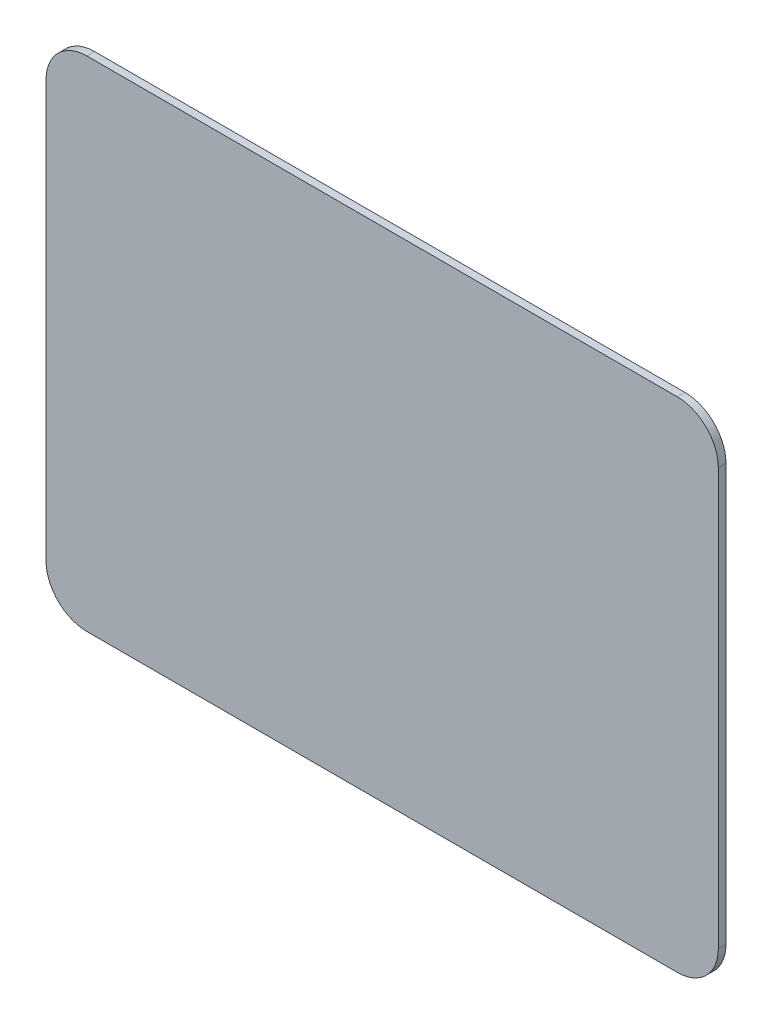
ISO-10303-21;
HEADER;
FILE_DESCRIPTION(('STEP AP214'),'2;1');
FILE_NAME('part.step','',(''),(''),'','','');
FILE_SCHEMA(('AUTOMOTIVE_DESIGN { 1 0 10303 214 1 1 1 1 }'));
ENDSEC;
DATA;
#1=APPLICATION_CONTEXT('core data for automotive mechanical design processes');
#2=APPLICATION_PROTOCOL_DEFINITION('international standard','automotive_design',2000,#1);
#3=PRODUCT_CONTEXT('',#1,'mechanical');
#4=PRODUCT('Part','Part','',(#3));
#5=PRODUCT_RELATED_PRODUCT_CATEGORY('part','',(#4));
#6=PRODUCT_DEFINITION_FORMATION('','',#4);
#7=PRODUCT_DEFINITION_CONTEXT('part definition',#1,'design');
#8=PRODUCT_DEFINITION('design','',#6,#7);
#9=PRODUCT_DEFINITION_SHAPE('','',#8);
#10=(LENGTH_UNIT() NAMED_UNIT(*) SI_UNIT(.MILLI.,.METRE.));
#11=(NAMED_UNIT(*) PLANE_ANGLE_UNIT() SI_UNIT($,.RADIAN.));
#12=(NAMED_UNIT(*) SI_UNIT($,.STERADIAN.) SOLID_ANGLE_UNIT());
#13=UNCERTAINTY_MEASURE_WITH_UNIT(LENGTH_MEASURE(1.E-05),#10,'distance_accuracy_value','');
#14=(GEOMETRIC_REPRESENTATION_CONTEXT(3) GLOBAL_UNCERTAINTY_ASSIGNED_CONTEXT((#13)) GLOBAL_UNIT_ASSIGNED_CONTEXT((#10,
#11,#12)) REPRESENTATION_CONTEXT('',''));
#15=CARTESIAN_POINT('',(0.,0.,0.));
#16=DIRECTION('',(0.,0.,1.));
#17=DIRECTION('',(1.,0.,0.));
#18=AXIS2_PLACEMENT_3D('',#15,#16,#17);
#19=CARTESIAN_POINT('',(0.,0.,0.03));
#20=DIRECTION('',(0.,0.,1.));
#21=DIRECTION('',(1.,0.,0.));
#22=AXIS2_PLACEMENT_3D('',#19,#20,#21);
#23=PLANE('',#22);
#24=CARTESIAN_POINT('',(-1.155,0.815,0.03));
#25=DIRECTION('',(0.,0.,1.));
#26=DIRECTION('',(1.,0.,0.));
#27=AXIS2_PLACEMENT_3D('',#24,#25,#26);
#28=CIRCLE('',#27,0.16);
#29=CARTESIAN_POINT('',(-1.155,0.975,0.03));
#30=VERTEX_POINT('',#29);
#31=CARTESIAN_POINT('',(-1.315,0.815,0.03));
#32=VERTEX_POINT('',#31);
#33=EDGE_CURVE('E123',#30,#32,#28,.T.);
#34=ORIENTED_EDGE('',*,*,#33,.T.);
#35=DIRECTION('',(0.,1.,0.));
#36=VECTOR('',#35,1.);
#37=CARTESIAN_POINT('',(-1.315,-0.815,0.03));
#38=LINE('',#37,#36);
#39=CARTESIAN_POINT('',(-1.315,-0.815,0.03));
#40=VERTEX_POINT('',#39);
#41=EDGE_CURVE('E164',#40,#32,#38,.T.);
#42=ORIENTED_EDGE('',*,*,#41,.F.);
#43=CARTESIAN_POINT('',(-1.155,-0.815,0.03));
#44=DIRECTION('',(0.,0.,1.));
#45=DIRECTION('',(1.,0.,0.));
#46=AXIS2_PLACEMENT_3D('',#43,#44,#45);
#47=CIRCLE('',#46,0.16);
#48=CARTESIAN_POINT('',(-1.155,-0.975,0.03));
#49=VERTEX_POINT('',#48);
#50=EDGE_CURVE('E172',#40,#49,#47,.T.);
#51=ORIENTED_EDGE('',*,*,#50,.T.);
#52=DIRECTION('',(-1.,0.,0.));
#53=VECTOR('',#52,1.);
#54=CARTESIAN_POINT('',(1.155,-0.975,0.03));
#55=LINE('',#54,#53);
#56=CARTESIAN_POINT('',(1.155,-0.975,0.03));
#57=VERTEX_POINT('',#56);
#58=EDGE_CURVE('E100',#57,#49,#55,.T.);
#59=ORIENTED_EDGE('',*,*,#58,.F.);
#60=CARTESIAN_POINT('',(1.155,-0.815,0.03));
#61=DIRECTION('',(0.,0.,1.));
#62=DIRECTION('',(1.,0.,0.));
#63=AXIS2_PLACEMENT_3D('',#60,#61,#62);
#64=CIRCLE('',#63,0.16);
#65=CARTESIAN_POINT('',(1.315,-0.815,0.03));
#66=VERTEX_POINT('',#65);
#67=EDGE_CURVE('E176',#57,#66,#64,.T.);
#68=ORIENTED_EDGE('',*,*,#67,.T.);
#69=DIRECTION('',(0.,-1.,0.));
#70=VECTOR('',#69,1.);
#71=CARTESIAN_POINT('',(1.315,0.815,0.03));
#72=LINE('',#71,#70);
#73=CARTESIAN_POINT('',(1.315,0.815,0.03));
#74=VERTEX_POINT('',#73);
#75=EDGE_CURVE('E60',#74,#66,#72,.T.);
#76=ORIENTED_EDGE('',*,*,#75,.F.);
#77=CARTESIAN_POINT('',(1.155,0.815,0.03));
#78=DIRECTION('',(0.,0.,1.));
#79=DIRECTION('',(1.,0.,0.));
#80=AXIS2_PLACEMENT_3D('',#77,#78,#79);
#81=CIRCLE('',#80,0.16);
#82=CARTESIAN_POINT('',(1.155,0.975,0.03));
#83=VERTEX_POINT('',#82);
#84=EDGE_CURVE('E125',#74,#83,#81,.T.);
#85=ORIENTED_EDGE('',*,*,#84,.T.);
#86=DIRECTION('',(1.,0.,0.));
#87=VECTOR('',#86,1.);
#88=CARTESIAN_POINT('',(-1.155,0.975,0.03));
#89=LINE('',#88,#87);
#90=EDGE_CURVE('E27',#30,#83,#89,.T.);
#91=ORIENTED_EDGE('',*,*,#90,.F.);
#92=EDGE_LOOP('',(#34,#42,#51,#59,#68,#76,#85,#91));
#93=FACE_BOUND('',#92,.T.);
#94=ADVANCED_FACE('F17',(#93),#23,.T.);
#95=CARTESIAN_POINT('',(0.,0.,0.));
#96=DIRECTION('',(0.,0.,1.));
#97=DIRECTION('',(1.,0.,0.));
#98=AXIS2_PLACEMENT_3D('',#95,#96,#97);
#99=PLANE('',#98);
#100=CARTESIAN_POINT('',(-1.155,0.815,0.));
#101=DIRECTION('',(0.,0.,1.));
#102=DIRECTION('',(1.,0.,0.));
#103=AXIS2_PLACEMENT_3D('',#100,#101,#102);
#104=CIRCLE('',#103,0.16);
#105=CARTESIAN_POINT('',(-1.155,0.975,0.));
#106=VERTEX_POINT('',#105);
#107=CARTESIAN_POINT('',(-1.315,0.815,0.));
#108=VERTEX_POINT('',#107);
#109=EDGE_CURVE('E141',#106,#108,#104,.T.);
#110=ORIENTED_EDGE('',*,*,#109,.F.);
#111=DIRECTION('',(1.,0.,0.));
#112=VECTOR('',#111,1.);
#113=CARTESIAN_POINT('',(-1.155,0.975,0.));
#114=LINE('',#113,#112);
#115=CARTESIAN_POINT('',(1.155,0.975,0.));
#116=VERTEX_POINT('',#115);
#117=EDGE_CURVE('E11',#106,#116,#114,.T.);
#118=ORIENTED_EDGE('',*,*,#117,.T.);
#119=CARTESIAN_POINT('',(1.155,0.815,0.));
#120=DIRECTION('',(0.,0.,1.));
#121=DIRECTION('',(1.,0.,0.));
#122=AXIS2_PLACEMENT_3D('',#119,#120,#121);
#123=CIRCLE('',#122,0.16);
#124=CARTESIAN_POINT('',(1.315,0.815,0.));
#125=VERTEX_POINT('',#124);
#126=EDGE_CURVE('E70',#125,#116,#123,.T.);
#127=ORIENTED_EDGE('',*,*,#126,.F.);
#128=DIRECTION('',(0.,-1.,0.));
#129=VECTOR('',#128,1.);
#130=CARTESIAN_POINT('',(1.315,0.815,0.));
#131=LINE('',#130,#129);
#132=CARTESIAN_POINT('',(1.315,-0.815,0.));
#133=VERTEX_POINT('',#132);
#134=EDGE_CURVE('E194',#125,#133,#131,.T.);
#135=ORIENTED_EDGE('',*,*,#134,.T.);
#136=CARTESIAN_POINT('',(1.155,-0.815,0.));
#137=DIRECTION('',(0.,0.,1.));
#138=DIRECTION('',(1.,0.,0.));
#139=AXIS2_PLACEMENT_3D('',#136,#137,#138);
#140=CIRCLE('',#139,0.16);
#141=CARTESIAN_POINT('',(1.155,-0.975,0.));
#142=VERTEX_POINT('',#141);
#143=EDGE_CURVE('E108',#142,#133,#140,.T.);
#144=ORIENTED_EDGE('',*,*,#143,.F.);
#145=DIRECTION('',(-1.,0.,0.));
#146=VECTOR('',#145,1.);
#147=CARTESIAN_POINT('',(1.155,-0.975,0.));
#148=LINE('',#147,#146);
#149=CARTESIAN_POINT('',(-1.155,-0.975,0.));
#150=VERTEX_POINT('',#149);
#151=EDGE_CURVE('E93',#142,#150,#148,.T.);
#152=ORIENTED_EDGE('',*,*,#151,.T.);
#153=CARTESIAN_POINT('',(-1.155,-0.815,0.));
#154=DIRECTION('',(0.,0.,1.));
#155=DIRECTION('',(1.,0.,0.));
#156=AXIS2_PLACEMENT_3D('',#153,#154,#155);
#157=CIRCLE('',#156,0.16);
#158=CARTESIAN_POINT('',(-1.315,-0.815,0.));
#159=VERTEX_POINT('',#158);
#160=EDGE_CURVE('E155',#159,#150,#157,.T.);
#161=ORIENTED_EDGE('',*,*,#160,.F.);
#162=DIRECTION('',(0.,1.,0.));
#163=VECTOR('',#162,1.);
#164=CARTESIAN_POINT('',(-1.315,-0.815,0.));
#165=LINE('',#164,#163);
#166=EDGE_CURVE('E159',#159,#108,#165,.T.);
#167=ORIENTED_EDGE('',*,*,#166,.T.);
#168=EDGE_LOOP('',(#110,#118,#127,#135,#144,#152,#161,#167));
#169=FACE_BOUND('',#168,.T.);
#170=ADVANCED_FACE('F19',(#169),#99,.F.);
#171=CARTESIAN_POINT('',(-1.155,0.975,0.));
#172=DIRECTION('',(0.,1.,0.));
#173=DIRECTION('',(1.,0.,0.));
#174=AXIS2_PLACEMENT_3D('',#171,#172,#173);
#175=PLANE('',#174);
#176=DIRECTION('',(0.,0.,1.));
#177=VECTOR('',#176,1.);
#178=CARTESIAN_POINT('',(-1.155,0.975,0.));
#179=LINE('',#178,#177);
#180=EDGE_CURVE('E132',#106,#30,#179,.T.);
#181=ORIENTED_EDGE('',*,*,#180,.T.);
#182=ORIENTED_EDGE('',*,*,#90,.T.);
#183=DIRECTION('',(0.,0.,1.));
#184=VECTOR('',#183,1.);
#185=CARTESIAN_POINT('',(1.155,0.975,0.));
#186=LINE('',#185,#184);
#187=EDGE_CURVE('E189',#116,#83,#186,.T.);
#188=ORIENTED_EDGE('',*,*,#187,.F.);
#189=ORIENTED_EDGE('',*,*,#117,.F.);
#190=EDGE_LOOP('',(#181,#182,#188,#189));
#191=FACE_BOUND('',#190,.T.);
#192=ADVANCED_FACE('F138',(#191),#175,.T.);
#193=CARTESIAN_POINT('',(1.155,0.815,0.));
#194=DIRECTION('',(0.,0.,-1.));
#195=DIRECTION('',(1.,0.,0.));
#196=AXIS2_PLACEMENT_3D('',#193,#194,#195);
#197=CYLINDRICAL_SURFACE('',#196,0.16);
#198=DIRECTION('',(0.,0.,1.));
#199=VECTOR('',#198,1.);
#200=CARTESIAN_POINT('',(1.315,0.815,0.));
#201=LINE('',#200,#199);
#202=EDGE_CURVE('E186',#125,#74,#201,.T.);
#203=ORIENTED_EDGE('',*,*,#202,.F.);
#204=ORIENTED_EDGE('',*,*,#126,.T.);
#205=ORIENTED_EDGE('',*,*,#187,.T.);
#206=ORIENTED_EDGE('',*,*,#84,.F.);
#207=EDGE_LOOP('',(#203,#204,#205,#206));
#208=FACE_BOUND('',#207,.T.);
#209=ADVANCED_FACE('F203',(#208),#197,.T.);
#210=CARTESIAN_POINT('',(1.315,0.815,0.));
#211=DIRECTION('',(1.,0.,0.));
#212=DIRECTION('',(0.,1.,0.));
#213=AXIS2_PLACEMENT_3D('',#210,#211,#212);
#214=PLANE('',#213);
#215=ORIENTED_EDGE('',*,*,#202,.T.);
#216=ORIENTED_EDGE('',*,*,#75,.T.);
#217=DIRECTION('',(0.,0.,1.));
#218=VECTOR('',#217,1.);
#219=CARTESIAN_POINT('',(1.315,-0.815,0.));
#220=LINE('',#219,#218);
#221=EDGE_CURVE('E151',#133,#66,#220,.T.);
#222=ORIENTED_EDGE('',*,*,#221,.F.);
#223=ORIENTED_EDGE('',*,*,#134,.F.);
#224=EDGE_LOOP('',(#215,#216,#222,#223));
#225=FACE_BOUND('',#224,.T.);
#226=ADVANCED_FACE('F204',(#225),#214,.T.);
#227=CARTESIAN_POINT('',(1.155,-0.815,0.));
#228=DIRECTION('',(0.,0.,-1.));
#229=DIRECTION('',(1.,0.,0.));
#230=AXIS2_PLACEMENT_3D('',#227,#228,#229);
#231=CYLINDRICAL_SURFACE('',#230,0.16);
#232=DIRECTION('',(0.,0.,1.));
#233=VECTOR('',#232,1.);
#234=CARTESIAN_POINT('',(1.155,-0.975,0.));
#235=LINE('',#234,#233);
#236=EDGE_CURVE('E154',#142,#57,#235,.T.);
#237=ORIENTED_EDGE('',*,*,#236,.F.);
#238=ORIENTED_EDGE('',*,*,#143,.T.);
#239=ORIENTED_EDGE('',*,*,#221,.T.);
#240=ORIENTED_EDGE('',*,*,#67,.F.);
#241=EDGE_LOOP('',(#237,#238,#239,#240));
#242=FACE_BOUND('',#241,.T.);
#243=ADVANCED_FACE('F219',(#242),#231,.T.);
#244=CARTESIAN_POINT('',(1.155,-0.975,0.));
#245=DIRECTION('',(0.,-1.,0.));
#246=DIRECTION('',(0.,0.,-1.));
#247=AXIS2_PLACEMENT_3D('',#244,#245,#246);
#248=PLANE('',#247);
#249=ORIENTED_EDGE('',*,*,#236,.T.);
#250=ORIENTED_EDGE('',*,*,#58,.T.);
#251=DIRECTION('',(0.,0.,1.));
#252=VECTOR('',#251,1.);
#253=CARTESIAN_POINT('',(-1.155,-0.975,0.));
#254=LINE('',#253,#252);
#255=EDGE_CURVE('E158',#150,#49,#254,.T.);
#256=ORIENTED_EDGE('',*,*,#255,.F.);
#257=ORIENTED_EDGE('',*,*,#151,.F.);
#258=EDGE_LOOP('',(#249,#250,#256,#257));
#259=FACE_BOUND('',#258,.T.);
#260=ADVANCED_FACE('F222',(#259),#248,.T.);
#261=CARTESIAN_POINT('',(-1.155,-0.815,0.));
#262=DIRECTION('',(0.,0.,-1.));
#263=DIRECTION('',(1.,0.,0.));
#264=AXIS2_PLACEMENT_3D('',#261,#262,#263);
#265=CYLINDRICAL_SURFACE('',#264,0.16);
#266=DIRECTION('',(0.,0.,1.));
#267=VECTOR('',#266,1.);
#268=CARTESIAN_POINT('',(-1.315,-0.815,0.));
#269=LINE('',#268,#267);
#270=EDGE_CURVE('E136',#159,#40,#269,.T.);
#271=ORIENTED_EDGE('',*,*,#270,.F.);
#272=ORIENTED_EDGE('',*,*,#160,.T.);
#273=ORIENTED_EDGE('',*,*,#255,.T.);
#274=ORIENTED_EDGE('',*,*,#50,.F.);
#275=EDGE_LOOP('',(#271,#272,#273,#274));
#276=FACE_BOUND('',#275,.T.);
#277=ADVANCED_FACE('F226',(#276),#265,.T.);
#278=CARTESIAN_POINT('',(-1.315,-0.815,0.));
#279=DIRECTION('',(-1.,0.,0.));
#280=DIRECTION('',(0.,0.,1.));
#281=AXIS2_PLACEMENT_3D('',#278,#279,#280);
#282=PLANE('',#281);
#283=ORIENTED_EDGE('',*,*,#270,.T.);
#284=ORIENTED_EDGE('',*,*,#41,.T.);
#285=DIRECTION('',(0.,0.,1.));
#286=VECTOR('',#285,1.);
#287=CARTESIAN_POINT('',(-1.315,0.815,0.));
#288=LINE('',#287,#286);
#289=EDGE_CURVE('E134',#108,#32,#288,.T.);
#290=ORIENTED_EDGE('',*,*,#289,.F.);
#291=ORIENTED_EDGE('',*,*,#166,.F.);
#292=EDGE_LOOP('',(#283,#284,#290,#291));
#293=FACE_BOUND('',#292,.T.);
#294=ADVANCED_FACE('F229',(#293),#282,.T.);
#295=CARTESIAN_POINT('',(-1.155,0.815,0.));
#296=DIRECTION('',(0.,0.,-1.));
#297=DIRECTION('',(1.,0.,0.));
#298=AXIS2_PLACEMENT_3D('',#295,#296,#297);
#299=CYLINDRICAL_SURFACE('',#298,0.16);
#300=ORIENTED_EDGE('',*,*,#180,.F.);
#301=ORIENTED_EDGE('',*,*,#109,.T.);
#302=ORIENTED_EDGE('',*,*,#289,.T.);
#303=ORIENTED_EDGE('',*,*,#33,.F.);
#304=EDGE_LOOP('',(#300,#301,#302,#303));
#305=FACE_BOUND('',#304,.T.);
#306=ADVANCED_FACE('F130',(#305),#299,.T.);
#307=CLOSED_SHELL('',(#94,#170,#192,#209,#226,#243,#260,#277,#294,#306));
#308=MANIFOLD_SOLID_BREP('B1',#307);
#309=ADVANCED_BREP_SHAPE_REPRESENTATION('',(#18,#308),#14);
#310=SHAPE_DEFINITION_REPRESENTATION(#9,#309);
ENDSEC;
END-ISO-10303-21;
